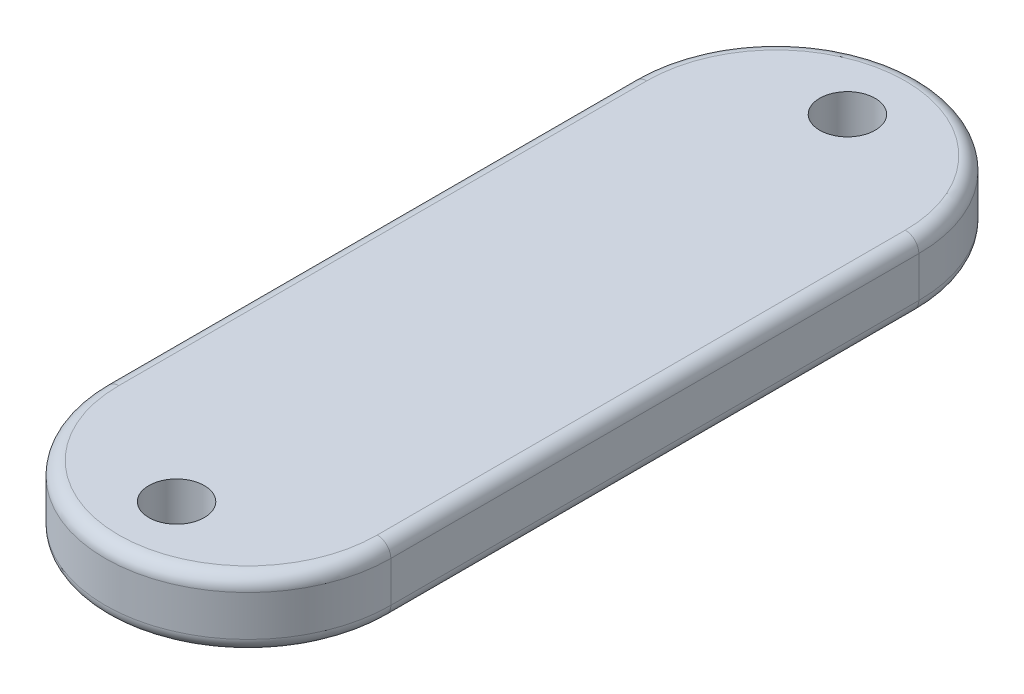
ISO-10303-21;
HEADER;
FILE_DESCRIPTION(('STEP AP214'),'2;1');
FILE_NAME('part.step','',(''),(''),'','','');
FILE_SCHEMA(('AUTOMOTIVE_DESIGN { 1 0 10303 214 1 1 1 1 }'));
ENDSEC;
DATA;
#1=APPLICATION_CONTEXT('core data for automotive mechanical design processes');
#2=APPLICATION_PROTOCOL_DEFINITION('international standard','automotive_design',2000,#1);
#3=PRODUCT_CONTEXT('',#1,'mechanical');
#4=PRODUCT('Part','Part','',(#3));
#5=PRODUCT_RELATED_PRODUCT_CATEGORY('part','',(#4));
#6=PRODUCT_DEFINITION_FORMATION('','',#4);
#7=PRODUCT_DEFINITION_CONTEXT('part definition',#1,'design');
#8=PRODUCT_DEFINITION('design','',#6,#7);
#9=PRODUCT_DEFINITION_SHAPE('','',#8);
#10=(LENGTH_UNIT() NAMED_UNIT(*) SI_UNIT(.MILLI.,.METRE.));
#11=(NAMED_UNIT(*) PLANE_ANGLE_UNIT() SI_UNIT($,.RADIAN.));
#12=(NAMED_UNIT(*) SI_UNIT($,.STERADIAN.) SOLID_ANGLE_UNIT());
#13=UNCERTAINTY_MEASURE_WITH_UNIT(LENGTH_MEASURE(1.E-05),#10,'distance_accuracy_value','');
#14=(GEOMETRIC_REPRESENTATION_CONTEXT(3) GLOBAL_UNCERTAINTY_ASSIGNED_CONTEXT((#13)) GLOBAL_UNIT_ASSIGNED_CONTEXT((#10,
#11,#12)) REPRESENTATION_CONTEXT('',''));
#15=CARTESIAN_POINT('',(0.,0.,0.));
#16=DIRECTION('',(0.,0.,1.));
#17=DIRECTION('',(1.,0.,0.));
#18=AXIS2_PLACEMENT_3D('',#15,#16,#17);
#19=CARTESIAN_POINT('',(0.,0.,-20.));
#20=DIRECTION('',(0.,0.,1.));
#21=DIRECTION('',(1.,0.,0.));
#22=AXIS2_PLACEMENT_3D('',#19,#20,#21);
#23=PLANE('',#22);
#24=DIRECTION('',(0.,-1.,0.));
#25=VECTOR('',#24,1.);
#26=CARTESIAN_POINT('',(2.95,0.,-20.));
#27=LINE('',#26,#25);
#28=CARTESIAN_POINT('',(2.95,10.1031353824411,-20.));
#29=VERTEX_POINT('',#28);
#30=CARTESIAN_POINT('',(2.95,8.48313538244112,-20.));
#31=VERTEX_POINT('',#30);
#32=EDGE_CURVE('E174',#29,#31,#27,.T.);
#33=ORIENTED_EDGE('',*,*,#32,.T.);
#34=DIRECTION('',(-1.,0.,0.));
#35=VECTOR('',#34,1.);
#36=CARTESIAN_POINT('',(0.,8.48313538244112,-20.));
#37=LINE('',#36,#35);
#38=CARTESIAN_POINT('',(-2.95,8.48313538244112,-20.));
#39=VERTEX_POINT('',#38);
#40=EDGE_CURVE('E140',#31,#39,#37,.T.);
#41=ORIENTED_EDGE('',*,*,#40,.T.);
#42=DIRECTION('',(0.,-1.,0.));
#43=VECTOR('',#42,1.);
#44=CARTESIAN_POINT('',(-2.95,0.,-20.));
#45=LINE('',#44,#43);
#46=CARTESIAN_POINT('',(-2.95,10.1031353824411,-20.));
#47=VERTEX_POINT('',#46);
#48=EDGE_CURVE('E162',#47,#39,#45,.T.);
#49=ORIENTED_EDGE('',*,*,#48,.F.);
#50=DIRECTION('',(1.,0.,0.));
#51=VECTOR('',#50,1.);
#52=CARTESIAN_POINT('',(0.,10.1031353824411,-20.));
#53=LINE('',#52,#51);
#54=EDGE_CURVE('E159',#47,#29,#53,.T.);
#55=ORIENTED_EDGE('',*,*,#54,.T.);
#56=EDGE_LOOP('',(#33,#41,#49,#55));
#57=FACE_BOUND('',#56,.T.);
#58=ADVANCED_FACE('F45',(#57),#23,.F.);
#59=CARTESIAN_POINT('',(0.,0.,0.));
#60=DIRECTION('',(0.,0.,1.));
#61=DIRECTION('',(1.,0.,0.));
#62=AXIS2_PLACEMENT_3D('',#59,#60,#61);
#63=PLANE('',#62);
#64=DIRECTION('',(-1.,0.,0.));
#65=VECTOR('',#64,1.);
#66=CARTESIAN_POINT('',(-2.95,8.48313538244112,0.));
#67=LINE('',#66,#65);
#68=CARTESIAN_POINT('',(2.95,8.48313538244112,0.));
#69=VERTEX_POINT('',#68);
#70=CARTESIAN_POINT('',(-2.95,8.48313538244112,0.));
#71=VERTEX_POINT('',#70);
#72=EDGE_CURVE('E137',#69,#71,#67,.T.);
#73=ORIENTED_EDGE('',*,*,#72,.F.);
#74=DIRECTION('',(0.,-1.,0.));
#75=VECTOR('',#74,1.);
#76=CARTESIAN_POINT('',(2.95,0.,0.));
#77=LINE('',#76,#75);
#78=CARTESIAN_POINT('',(2.95,10.1031353824411,0.));
#79=VERTEX_POINT('',#78);
#80=EDGE_CURVE('E151',#79,#69,#77,.T.);
#81=ORIENTED_EDGE('',*,*,#80,.F.);
#82=DIRECTION('',(1.,0.,0.));
#83=VECTOR('',#82,1.);
#84=CARTESIAN_POINT('',(0.,10.1031353824411,0.));
#85=LINE('',#84,#83);
#86=CARTESIAN_POINT('',(-2.95,10.1031353824411,0.));
#87=VERTEX_POINT('',#86);
#88=EDGE_CURVE('E164',#87,#79,#85,.T.);
#89=ORIENTED_EDGE('',*,*,#88,.F.);
#90=DIRECTION('',(0.,-1.,0.));
#91=VECTOR('',#90,1.);
#92=CARTESIAN_POINT('',(-2.95,0.,0.));
#93=LINE('',#92,#91);
#94=EDGE_CURVE('E153',#87,#71,#93,.T.);
#95=ORIENTED_EDGE('',*,*,#94,.T.);
#96=EDGE_LOOP('',(#73,#81,#89,#95));
#97=FACE_BOUND('',#96,.T.);
#98=ADVANCED_FACE('F149',(#97),#63,.T.);
#99=CARTESIAN_POINT('',(2.95,0.,-20.));
#100=DIRECTION('',(-1.,0.,0.));
#101=DIRECTION('',(0.,0.,1.));
#102=AXIS2_PLACEMENT_3D('',#99,#100,#101);
#103=PLANE('',#102);
#104=ORIENTED_EDGE('',*,*,#80,.T.);
#105=DIRECTION('',(0.,0.,1.));
#106=VECTOR('',#105,1.);
#107=CARTESIAN_POINT('',(2.95,8.48313538244112,-20.));
#108=LINE('',#107,#106);
#109=EDGE_CURVE('E134',#31,#69,#108,.T.);
#110=ORIENTED_EDGE('',*,*,#109,.F.);
#111=ORIENTED_EDGE('',*,*,#32,.F.);
#112=DIRECTION('',(0.,0.,1.));
#113=VECTOR('',#112,1.);
#114=CARTESIAN_POINT('',(2.95,10.1031353824411,-20.));
#115=LINE('',#114,#113);
#116=EDGE_CURVE('E144',#29,#79,#115,.T.);
#117=ORIENTED_EDGE('',*,*,#116,.T.);
#118=EDGE_LOOP('',(#104,#110,#111,#117));
#119=FACE_BOUND('',#118,.T.);
#120=ADVANCED_FACE('F156',(#119),#103,.F.);
#121=CARTESIAN_POINT('',(-2.95,0.,-20.));
#122=DIRECTION('',(-1.,0.,0.));
#123=DIRECTION('',(0.,0.,1.));
#124=AXIS2_PLACEMENT_3D('',#121,#122,#123);
#125=PLANE('',#124);
#126=ORIENTED_EDGE('',*,*,#94,.F.);
#127=DIRECTION('',(0.,0.,1.));
#128=VECTOR('',#127,1.);
#129=CARTESIAN_POINT('',(-2.95,10.1031353824411,-20.));
#130=LINE('',#129,#128);
#131=EDGE_CURVE('E171',#47,#87,#130,.T.);
#132=ORIENTED_EDGE('',*,*,#131,.F.);
#133=ORIENTED_EDGE('',*,*,#48,.T.);
#134=DIRECTION('',(0.,0.,1.));
#135=VECTOR('',#134,1.);
#136=CARTESIAN_POINT('',(-2.95,8.48313538244112,-20.));
#137=LINE('',#136,#135);
#138=EDGE_CURVE('E145',#39,#71,#137,.T.);
#139=ORIENTED_EDGE('',*,*,#138,.T.);
#140=EDGE_LOOP('',(#126,#132,#133,#139));
#141=FACE_BOUND('',#140,.T.);
#142=ADVANCED_FACE('F261',(#141),#125,.T.);
#143=CARTESIAN_POINT('',(0.,10.1031353824411,0.));
#144=DIRECTION('',(0.,1.,0.));
#145=DIRECTION('',(0.,0.,1.));
#146=AXIS2_PLACEMENT_3D('',#143,#144,#145);
#147=PLANE('',#146);
#148=CARTESIAN_POINT('',(0.,10.1031353824411,9.5));
#149=DIRECTION('',(0.,1.,0.));
#150=DIRECTION('',(0.,0.,1.));
#151=AXIS2_PLACEMENT_3D('',#148,#149,#150);
#152=CIRCLE('',#151,9.55);
#153=CARTESIAN_POINT('',(9.55,10.1031353824411,9.5));
#154=VERTEX_POINT('',#153);
#155=CARTESIAN_POINT('',(-9.55,10.1031353824411,9.5));
#156=VERTEX_POINT('',#155);
#157=EDGE_CURVE('E180',#154,#156,#152,.F.);
#158=ORIENTED_EDGE('',*,*,#157,.T.);
#159=DIRECTION('',(0.,0.,1.));
#160=VECTOR('',#159,1.);
#161=CARTESIAN_POINT('',(-9.55,10.1031353824411,0.));
#162=LINE('',#161,#160);
#163=CARTESIAN_POINT('',(-9.55,10.1031353824411,-29.5));
#164=VERTEX_POINT('',#163);
#165=EDGE_CURVE('E186',#156,#164,#162,.F.);
#166=ORIENTED_EDGE('',*,*,#165,.T.);
#167=CARTESIAN_POINT('',(0.,10.1031353824411,-29.5));
#168=DIRECTION('',(0.,1.,0.));
#169=DIRECTION('',(0.,0.,1.));
#170=AXIS2_PLACEMENT_3D('',#167,#168,#169);
#171=CIRCLE('',#170,9.55);
#172=CARTESIAN_POINT('',(9.54999999999999,10.1031353824411,-29.5));
#173=VERTEX_POINT('',#172);
#174=EDGE_CURVE('E184',#164,#173,#171,.F.);
#175=ORIENTED_EDGE('',*,*,#174,.T.);
#176=DIRECTION('',(0.,0.,-1.));
#177=VECTOR('',#176,1.);
#178=CARTESIAN_POINT('',(9.55,10.1031353824411,0.));
#179=LINE('',#178,#177);
#180=EDGE_CURVE('E182',#173,#154,#179,.F.);
#181=ORIENTED_EDGE('',*,*,#180,.T.);
#182=EDGE_LOOP('',(#158,#166,#175,#181));
#183=FACE_BOUND('',#182,.T.);
#184=ORIENTED_EDGE('',*,*,#131,.T.);
#185=ORIENTED_EDGE('',*,*,#88,.T.);
#186=ORIENTED_EDGE('',*,*,#116,.F.);
#187=ORIENTED_EDGE('',*,*,#54,.F.);
#188=EDGE_LOOP('',(#184,#185,#186,#187));
#189=FACE_BOUND('',#188,.T.);
#190=CARTESIAN_POINT('',(0.,10.1031353824411,14.775));
#191=DIRECTION('',(0.,1.,0.));
#192=DIRECTION('',(0.,0.,1.));
#193=AXIS2_PLACEMENT_3D('',#190,#191,#192);
#194=CIRCLE('',#193,2.05);
#195=CARTESIAN_POINT('',(0.,10.1031353824411,16.825));
#196=VERTEX_POINT('',#195);
#197=EDGE_CURVE('E486',#196,#196,#194,.T.);
#198=ORIENTED_EDGE('',*,*,#197,.T.);
#199=EDGE_LOOP('',(#198));
#200=FACE_BOUND('',#199,.T.);
#201=CARTESIAN_POINT('',(0.,10.1031353824411,-34.775));
#202=DIRECTION('',(0.,1.,0.));
#203=DIRECTION('',(0.,0.,1.));
#204=AXIS2_PLACEMENT_3D('',#201,#202,#203);
#205=CIRCLE('',#204,2.05);
#206=CARTESIAN_POINT('',(0.,10.1031353824411,-32.725));
#207=VERTEX_POINT('',#206);
#208=EDGE_CURVE('E154',#207,#207,#205,.T.);
#209=ORIENTED_EDGE('',*,*,#208,.T.);
#210=EDGE_LOOP('',(#209));
#211=FACE_BOUND('',#210,.T.);
#212=ADVANCED_FACE('F256',(#183,#189,#200,#211),#147,.F.);
#213=CARTESIAN_POINT('',(10.55,15.1031353824411,-29.5));
#214=DIRECTION('',(-1.,0.,0.));
#215=DIRECTION('',(0.,0.,1.));
#216=AXIS2_PLACEMENT_3D('',#213,#214,#215);
#217=PLANE('',#216);
#218=DIRECTION('',(0.,-1.,0.));
#219=VECTOR('',#218,1.);
#220=CARTESIAN_POINT('',(10.55,15.1031353824411,9.5));
#221=LINE('',#220,#219);
#222=CARTESIAN_POINT('',(10.55,14.1031353824411,9.5));
#223=VERTEX_POINT('',#222);
#224=CARTESIAN_POINT('',(10.55,11.1031353824411,9.5));
#225=VERTEX_POINT('',#224);
#226=EDGE_CURVE('E235',#223,#225,#221,.T.);
#227=ORIENTED_EDGE('',*,*,#226,.T.);
#228=DIRECTION('',(0.,0.,-1.));
#229=VECTOR('',#228,1.);
#230=CARTESIAN_POINT('',(10.55,11.1031353824411,-29.5));
#231=LINE('',#230,#229);
#232=CARTESIAN_POINT('',(10.55,11.1031353824411,-29.5));
#233=VERTEX_POINT('',#232);
#234=EDGE_CURVE('E195',#225,#233,#231,.T.);
#235=ORIENTED_EDGE('',*,*,#234,.T.);
#236=DIRECTION('',(0.,-1.,0.));
#237=VECTOR('',#236,1.);
#238=CARTESIAN_POINT('',(10.55,15.1031353824411,-29.5));
#239=LINE('',#238,#237);
#240=CARTESIAN_POINT('',(10.55,14.1031353824411,-29.5));
#241=VERTEX_POINT('',#240);
#242=EDGE_CURVE('E238',#241,#233,#239,.T.);
#243=ORIENTED_EDGE('',*,*,#242,.F.);
#244=DIRECTION('',(0.,0.,-1.));
#245=VECTOR('',#244,1.);
#246=CARTESIAN_POINT('',(10.55,14.1031353824411,9.5));
#247=LINE('',#246,#245);
#248=EDGE_CURVE('E193',#241,#223,#247,.F.);
#249=ORIENTED_EDGE('',*,*,#248,.T.);
#250=EDGE_LOOP('',(#227,#235,#243,#249));
#251=FACE_BOUND('',#250,.T.);
#252=ADVANCED_FACE('F234',(#251),#217,.F.);
#253=CARTESIAN_POINT('',(-10.55,15.1031353824411,-29.5));
#254=DIRECTION('',(1.,0.,0.));
#255=DIRECTION('',(0.,0.,-1.));
#256=AXIS2_PLACEMENT_3D('',#253,#254,#255);
#257=PLANE('',#256);
#258=DIRECTION('',(0.,-1.,0.));
#259=VECTOR('',#258,1.);
#260=CARTESIAN_POINT('',(-10.55,15.1031353824411,-29.5));
#261=LINE('',#260,#259);
#262=CARTESIAN_POINT('',(-10.55,14.1031353824411,-29.5));
#263=VERTEX_POINT('',#262);
#264=CARTESIAN_POINT('',(-10.55,11.1031353824411,-29.5));
#265=VERTEX_POINT('',#264);
#266=EDGE_CURVE('E246',#263,#265,#261,.T.);
#267=ORIENTED_EDGE('',*,*,#266,.T.);
#268=DIRECTION('',(0.,0.,1.));
#269=VECTOR('',#268,1.);
#270=CARTESIAN_POINT('',(-10.55,11.1031353824411,-29.5));
#271=LINE('',#270,#269);
#272=CARTESIAN_POINT('',(-10.55,11.1031353824411,9.5));
#273=VERTEX_POINT('',#272);
#274=EDGE_CURVE('E177',#265,#273,#271,.T.);
#275=ORIENTED_EDGE('',*,*,#274,.T.);
#276=DIRECTION('',(0.,-1.,0.));
#277=VECTOR('',#276,1.);
#278=CARTESIAN_POINT('',(-10.55,15.1031353824411,9.5));
#279=LINE('',#278,#277);
#280=CARTESIAN_POINT('',(-10.55,14.1031353824411,9.5));
#281=VERTEX_POINT('',#280);
#282=EDGE_CURVE('E244',#281,#273,#279,.T.);
#283=ORIENTED_EDGE('',*,*,#282,.F.);
#284=DIRECTION('',(0.,0.,1.));
#285=VECTOR('',#284,1.);
#286=CARTESIAN_POINT('',(-10.55,14.1031353824411,-29.5));
#287=LINE('',#286,#285);
#288=EDGE_CURVE('E168',#281,#263,#287,.F.);
#289=ORIENTED_EDGE('',*,*,#288,.T.);
#290=EDGE_LOOP('',(#267,#275,#283,#289));
#291=FACE_BOUND('',#290,.T.);
#292=ADVANCED_FACE('F352',(#291),#257,.F.);
#293=CARTESIAN_POINT('',(0.,15.1031353824411,0.));
#294=DIRECTION('',(0.,1.,0.));
#295=DIRECTION('',(0.,0.,1.));
#296=AXIS2_PLACEMENT_3D('',#293,#294,#295);
#297=PLANE('',#296);
#298=CARTESIAN_POINT('',(0.,15.1031353824411,-29.5));
#299=DIRECTION('',(0.,1.,0.));
#300=DIRECTION('',(0.,0.,1.));
#301=AXIS2_PLACEMENT_3D('',#298,#299,#300);
#302=CIRCLE('',#301,9.55);
#303=CARTESIAN_POINT('',(9.54999999999999,15.1031353824411,-29.5));
#304=VERTEX_POINT('',#303);
#305=CARTESIAN_POINT('',(-9.55,15.1031353824411,-29.5));
#306=VERTEX_POINT('',#305);
#307=EDGE_CURVE('E62',#304,#306,#302,.T.);
#308=ORIENTED_EDGE('',*,*,#307,.T.);
#309=DIRECTION('',(0.,0.,1.));
#310=VECTOR('',#309,1.);
#311=CARTESIAN_POINT('',(-9.55,15.1031353824411,9.5));
#312=LINE('',#311,#310);
#313=CARTESIAN_POINT('',(-9.55,15.1031353824411,9.5));
#314=VERTEX_POINT('',#313);
#315=EDGE_CURVE('E201',#306,#314,#312,.T.);
#316=ORIENTED_EDGE('',*,*,#315,.T.);
#317=CARTESIAN_POINT('',(0.,15.1031353824411,9.5));
#318=DIRECTION('',(0.,1.,0.));
#319=DIRECTION('',(0.,0.,1.));
#320=AXIS2_PLACEMENT_3D('',#317,#318,#319);
#321=CIRCLE('',#320,9.55);
#322=CARTESIAN_POINT('',(9.55,15.1031353824411,9.5));
#323=VERTEX_POINT('',#322);
#324=EDGE_CURVE('E197',#314,#323,#321,.T.);
#325=ORIENTED_EDGE('',*,*,#324,.T.);
#326=DIRECTION('',(0.,0.,-1.));
#327=VECTOR('',#326,1.);
#328=CARTESIAN_POINT('',(9.54999999999999,15.1031353824411,-29.5));
#329=LINE('',#328,#327);
#330=EDGE_CURVE('E67',#323,#304,#329,.T.);
#331=ORIENTED_EDGE('',*,*,#330,.T.);
#332=EDGE_LOOP('',(#308,#316,#325,#331));
#333=FACE_BOUND('',#332,.T.);
#334=CARTESIAN_POINT('',(0.,15.1031353824411,14.775));
#335=DIRECTION('',(0.,1.,0.));
#336=DIRECTION('',(0.,0.,1.));
#337=AXIS2_PLACEMENT_3D('',#334,#335,#336);
#338=CIRCLE('',#337,2.05);
#339=CARTESIAN_POINT('',(0.,15.1031353824411,16.825));
#340=VERTEX_POINT('',#339);
#341=EDGE_CURVE('E214',#340,#340,#338,.T.);
#342=ORIENTED_EDGE('',*,*,#341,.F.);
#343=EDGE_LOOP('',(#342));
#344=FACE_BOUND('',#343,.T.);
#345=CARTESIAN_POINT('',(0.,15.1031353824411,-34.775));
#346=DIRECTION('',(0.,1.,0.));
#347=DIRECTION('',(0.,0.,1.));
#348=AXIS2_PLACEMENT_3D('',#345,#346,#347);
#349=CIRCLE('',#348,2.05);
#350=CARTESIAN_POINT('',(0.,15.1031353824411,-32.725));
#351=VERTEX_POINT('',#350);
#352=EDGE_CURVE('E491',#351,#351,#349,.T.);
#353=ORIENTED_EDGE('',*,*,#352,.F.);
#354=EDGE_LOOP('',(#353));
#355=FACE_BOUND('',#354,.T.);
#356=ADVANCED_FACE('F348',(#333,#344,#355),#297,.T.);
#357=CARTESIAN_POINT('',(-2.95,8.48313538244112,-29.5));
#358=DIRECTION('',(0.,1.,0.));
#359=DIRECTION('',(0.,0.,1.));
#360=AXIS2_PLACEMENT_3D('',#357,#358,#359);
#361=PLANE('',#360);
#362=ORIENTED_EDGE('',*,*,#72,.T.);
#363=ORIENTED_EDGE('',*,*,#138,.F.);
#364=ORIENTED_EDGE('',*,*,#40,.F.);
#365=ORIENTED_EDGE('',*,*,#109,.T.);
#366=EDGE_LOOP('',(#362,#363,#364,#365));
#367=FACE_BOUND('',#366,.T.);
#368=ADVANCED_FACE('F136',(#367),#361,.F.);
#369=CARTESIAN_POINT('',(0.,10.1031353824411,14.775));
#370=DIRECTION('',(0.,1.,0.));
#371=DIRECTION('',(0.,0.,1.));
#372=AXIS2_PLACEMENT_3D('',#369,#370,#371);
#373=CYLINDRICAL_SURFACE('',#372,2.05);
#374=ORIENTED_EDGE('',*,*,#197,.F.);
#375=EDGE_LOOP('',(#374));
#376=FACE_BOUND('',#375,.T.);
#377=ORIENTED_EDGE('',*,*,#341,.T.);
#378=EDGE_LOOP('',(#377));
#379=FACE_BOUND('',#378,.T.);
#380=ADVANCED_FACE('F342',(#376,#379),#373,.F.);
#381=CARTESIAN_POINT('',(0.,10.1031353824411,9.5));
#382=DIRECTION('',(0.,1.,0.));
#383=DIRECTION('',(0.,0.,1.));
#384=AXIS2_PLACEMENT_3D('',#381,#382,#383);
#385=CYLINDRICAL_SURFACE('',#384,10.55);
#386=ORIENTED_EDGE('',*,*,#282,.T.);
#387=CARTESIAN_POINT('',(0.,11.1031353824411,9.5));
#388=DIRECTION('',(0.,1.,0.));
#389=DIRECTION('',(0.,0.,1.));
#390=AXIS2_PLACEMENT_3D('',#387,#388,#389);
#391=CIRCLE('',#390,10.55);
#392=EDGE_CURVE('E11',#273,#225,#391,.T.);
#393=ORIENTED_EDGE('',*,*,#392,.T.);
#394=ORIENTED_EDGE('',*,*,#226,.F.);
#395=CARTESIAN_POINT('',(0.,14.1031353824411,9.5));
#396=DIRECTION('',(0.,1.,0.));
#397=DIRECTION('',(0.,0.,1.));
#398=AXIS2_PLACEMENT_3D('',#395,#396,#397);
#399=CIRCLE('',#398,10.55);
#400=EDGE_CURVE('E54',#223,#281,#399,.F.);
#401=ORIENTED_EDGE('',*,*,#400,.T.);
#402=EDGE_LOOP('',(#386,#393,#394,#401));
#403=FACE_BOUND('',#402,.T.);
#404=ADVANCED_FACE('F241',(#403),#385,.T.);
#405=CARTESIAN_POINT('',(0.,10.1031353824411,-29.5));
#406=DIRECTION('',(0.,1.,0.));
#407=DIRECTION('',(0.,0.,1.));
#408=AXIS2_PLACEMENT_3D('',#405,#406,#407);
#409=CYLINDRICAL_SURFACE('',#408,10.55);
#410=ORIENTED_EDGE('',*,*,#242,.T.);
#411=CARTESIAN_POINT('',(0.,11.1031353824411,-29.5));
#412=DIRECTION('',(0.,1.,0.));
#413=DIRECTION('',(0.,0.,1.));
#414=AXIS2_PLACEMENT_3D('',#411,#412,#413);
#415=CIRCLE('',#414,10.55);
#416=EDGE_CURVE('E191',#233,#265,#415,.T.);
#417=ORIENTED_EDGE('',*,*,#416,.T.);
#418=ORIENTED_EDGE('',*,*,#266,.F.);
#419=CARTESIAN_POINT('',(0.,14.1031353824411,-29.5));
#420=DIRECTION('',(0.,1.,0.));
#421=DIRECTION('',(0.,0.,1.));
#422=AXIS2_PLACEMENT_3D('',#419,#420,#421);
#423=CIRCLE('',#422,10.55);
#424=EDGE_CURVE('E189',#263,#241,#423,.F.);
#425=ORIENTED_EDGE('',*,*,#424,.T.);
#426=EDGE_LOOP('',(#410,#417,#418,#425));
#427=FACE_BOUND('',#426,.T.);
#428=ADVANCED_FACE('F330',(#427),#409,.T.);
#429=CARTESIAN_POINT('',(0.,10.1031353824411,-34.775));
#430=DIRECTION('',(0.,1.,0.));
#431=DIRECTION('',(0.,0.,1.));
#432=AXIS2_PLACEMENT_3D('',#429,#430,#431);
#433=CYLINDRICAL_SURFACE('',#432,2.05);
#434=ORIENTED_EDGE('',*,*,#208,.F.);
#435=EDGE_LOOP('',(#434));
#436=FACE_BOUND('',#435,.T.);
#437=ORIENTED_EDGE('',*,*,#352,.T.);
#438=EDGE_LOOP('',(#437));
#439=FACE_BOUND('',#438,.T.);
#440=ADVANCED_FACE('F291',(#436,#439),#433,.F.);
#441=CARTESIAN_POINT('',(9.54999999999999,11.1031353824411,-29.5));
#442=DIRECTION('',(0.,0.,-1.));
#443=DIRECTION('',(-1.,0.,0.));
#444=AXIS2_PLACEMENT_3D('',#441,#442,#443);
#445=CYLINDRICAL_SURFACE('',#444,1.);
#446=CARTESIAN_POINT('',(9.55,11.1031353824411,9.5));
#447=DIRECTION('',(0.,0.,1.));
#448=DIRECTION('',(1.,0.,0.));
#449=AXIS2_PLACEMENT_3D('',#446,#447,#448);
#450=CIRCLE('',#449,1.);
#451=EDGE_CURVE('E208',#154,#225,#450,.T.);
#452=ORIENTED_EDGE('',*,*,#451,.F.);
#453=ORIENTED_EDGE('',*,*,#180,.F.);
#454=CARTESIAN_POINT('',(9.54999999999999,11.1031353824411,-29.5));
#455=DIRECTION('',(0.,0.,-1.));
#456=DIRECTION('',(-1.,0.,0.));
#457=AXIS2_PLACEMENT_3D('',#454,#455,#456);
#458=CIRCLE('',#457,1.);
#459=EDGE_CURVE('E211',#233,#173,#458,.T.);
#460=ORIENTED_EDGE('',*,*,#459,.F.);
#461=ORIENTED_EDGE('',*,*,#234,.F.);
#462=EDGE_LOOP('',(#452,#453,#460,#461));
#463=FACE_BOUND('',#462,.T.);
#464=ADVANCED_FACE('F287',(#463),#445,.T.);
#465=CARTESIAN_POINT('',(0.,11.1031353824411,-29.5));
#466=DIRECTION('',(0.,1.,0.));
#467=DIRECTION('',(0.,0.,1.));
#468=AXIS2_PLACEMENT_3D('',#465,#466,#467);
#469=TOROIDAL_SURFACE('',#468,9.55,1.);
#470=ORIENTED_EDGE('',*,*,#459,.T.);
#471=ORIENTED_EDGE('',*,*,#174,.F.);
#472=CARTESIAN_POINT('',(-9.55,11.1031353824411,-29.5));
#473=DIRECTION('',(0.,0.,1.));
#474=DIRECTION('',(1.,0.,0.));
#475=AXIS2_PLACEMENT_3D('',#472,#473,#474);
#476=CIRCLE('',#475,1.);
#477=EDGE_CURVE('E206',#265,#164,#476,.T.);
#478=ORIENTED_EDGE('',*,*,#477,.F.);
#479=ORIENTED_EDGE('',*,*,#416,.F.);
#480=EDGE_LOOP('',(#470,#471,#478,#479));
#481=FACE_BOUND('',#480,.T.);
#482=ADVANCED_FACE('F283',(#481),#469,.T.);
#483=CARTESIAN_POINT('',(0.,11.1031353824411,9.5));
#484=DIRECTION('',(0.,1.,0.));
#485=DIRECTION('',(0.,0.,1.));
#486=AXIS2_PLACEMENT_3D('',#483,#484,#485);
#487=TOROIDAL_SURFACE('',#486,9.55,1.);
#488=ORIENTED_EDGE('',*,*,#451,.T.);
#489=ORIENTED_EDGE('',*,*,#392,.F.);
#490=CARTESIAN_POINT('',(-9.55,11.1031353824411,9.5));
#491=DIRECTION('',(0.,0.,-1.));
#492=DIRECTION('',(-1.,0.,0.));
#493=AXIS2_PLACEMENT_3D('',#490,#491,#492);
#494=CIRCLE('',#493,1.);
#495=EDGE_CURVE('E204',#156,#273,#494,.T.);
#496=ORIENTED_EDGE('',*,*,#495,.F.);
#497=ORIENTED_EDGE('',*,*,#157,.F.);
#498=EDGE_LOOP('',(#488,#489,#496,#497));
#499=FACE_BOUND('',#498,.T.);
#500=ADVANCED_FACE('F279',(#499),#487,.T.);
#501=CARTESIAN_POINT('',(-9.55,11.1031353824411,-29.5));
#502=DIRECTION('',(0.,0.,1.));
#503=DIRECTION('',(1.,0.,0.));
#504=AXIS2_PLACEMENT_3D('',#501,#502,#503);
#505=CYLINDRICAL_SURFACE('',#504,1.);
#506=ORIENTED_EDGE('',*,*,#477,.T.);
#507=ORIENTED_EDGE('',*,*,#165,.F.);
#508=ORIENTED_EDGE('',*,*,#495,.T.);
#509=ORIENTED_EDGE('',*,*,#274,.F.);
#510=EDGE_LOOP('',(#506,#507,#508,#509));
#511=FACE_BOUND('',#510,.T.);
#512=ADVANCED_FACE('F276',(#511),#505,.T.);
#513=CARTESIAN_POINT('',(9.55,14.1031353824411,0.));
#514=DIRECTION('',(0.,0.,1.));
#515=DIRECTION('',(1.,0.,0.));
#516=AXIS2_PLACEMENT_3D('',#513,#514,#515);
#517=CYLINDRICAL_SURFACE('',#516,1.);
#518=CARTESIAN_POINT('',(9.55,14.1031353824411,9.5));
#519=DIRECTION('',(0.,0.,1.));
#520=DIRECTION('',(1.,0.,0.));
#521=AXIS2_PLACEMENT_3D('',#518,#519,#520);
#522=CIRCLE('',#521,1.);
#523=EDGE_CURVE('E218',#223,#323,#522,.T.);
#524=ORIENTED_EDGE('',*,*,#523,.F.);
#525=ORIENTED_EDGE('',*,*,#248,.F.);
#526=CARTESIAN_POINT('',(9.54999999999999,14.1031353824411,-29.5));
#527=DIRECTION('',(0.,0.,-1.));
#528=DIRECTION('',(-1.,0.,0.));
#529=AXIS2_PLACEMENT_3D('',#526,#527,#528);
#530=CIRCLE('',#529,1.);
#531=EDGE_CURVE('E49',#304,#241,#530,.T.);
#532=ORIENTED_EDGE('',*,*,#531,.F.);
#533=ORIENTED_EDGE('',*,*,#330,.F.);
#534=EDGE_LOOP('',(#524,#525,#532,#533));
#535=FACE_BOUND('',#534,.T.);
#536=ADVANCED_FACE('F47',(#535),#517,.T.);
#537=CARTESIAN_POINT('',(0.,14.1031353824411,-29.5));
#538=DIRECTION('',(0.,1.,0.));
#539=DIRECTION('',(0.,0.,1.));
#540=AXIS2_PLACEMENT_3D('',#537,#538,#539);
#541=TOROIDAL_SURFACE('',#540,9.55,1.);
#542=ORIENTED_EDGE('',*,*,#531,.T.);
#543=ORIENTED_EDGE('',*,*,#424,.F.);
#544=CARTESIAN_POINT('',(-9.55,14.1031353824411,-29.5));
#545=DIRECTION('',(0.,0.,1.));
#546=DIRECTION('',(1.,0.,0.));
#547=AXIS2_PLACEMENT_3D('',#544,#545,#546);
#548=CIRCLE('',#547,1.);
#549=EDGE_CURVE('E217',#306,#263,#548,.T.);
#550=ORIENTED_EDGE('',*,*,#549,.F.);
#551=ORIENTED_EDGE('',*,*,#307,.F.);
#552=EDGE_LOOP('',(#542,#543,#550,#551));
#553=FACE_BOUND('',#552,.T.);
#554=ADVANCED_FACE('F227',(#553),#541,.T.);
#555=CARTESIAN_POINT('',(0.,14.1031353824411,9.5));
#556=DIRECTION('',(0.,1.,0.));
#557=DIRECTION('',(0.,0.,1.));
#558=AXIS2_PLACEMENT_3D('',#555,#556,#557);
#559=TOROIDAL_SURFACE('',#558,9.55,1.);
#560=ORIENTED_EDGE('',*,*,#523,.T.);
#561=ORIENTED_EDGE('',*,*,#324,.F.);
#562=CARTESIAN_POINT('',(-9.55,14.1031353824411,9.5));
#563=DIRECTION('',(0.,0.,-1.));
#564=DIRECTION('',(-1.,0.,0.));
#565=AXIS2_PLACEMENT_3D('',#562,#563,#564);
#566=CIRCLE('',#565,1.);
#567=EDGE_CURVE('E215',#281,#314,#566,.T.);
#568=ORIENTED_EDGE('',*,*,#567,.F.);
#569=ORIENTED_EDGE('',*,*,#400,.F.);
#570=EDGE_LOOP('',(#560,#561,#568,#569));
#571=FACE_BOUND('',#570,.T.);
#572=ADVANCED_FACE('F296',(#571),#559,.T.);
#573=CARTESIAN_POINT('',(-9.55,14.1031353824411,0.));
#574=DIRECTION('',(0.,0.,-1.));
#575=DIRECTION('',(-1.,0.,0.));
#576=AXIS2_PLACEMENT_3D('',#573,#574,#575);
#577=CYLINDRICAL_SURFACE('',#576,1.);
#578=ORIENTED_EDGE('',*,*,#549,.T.);
#579=ORIENTED_EDGE('',*,*,#288,.F.);
#580=ORIENTED_EDGE('',*,*,#567,.T.);
#581=ORIENTED_EDGE('',*,*,#315,.F.);
#582=EDGE_LOOP('',(#578,#579,#580,#581));
#583=FACE_BOUND('',#582,.T.);
#584=ADVANCED_FACE('F293',(#583),#577,.T.);
#585=CLOSED_SHELL('',(#58,#98,#120,#142,#212,#252,#292,#356,#368,#380,#404,#428,#440,#464,#482,
#500,#512,#536,#554,#572,#584));
#586=MANIFOLD_SOLID_BREP('B2',#585);
#587=ADVANCED_BREP_SHAPE_REPRESENTATION('',(#18,#586),#14);
#588=SHAPE_DEFINITION_REPRESENTATION(#9,#587);
ENDSEC;
END-ISO-10303-21;
